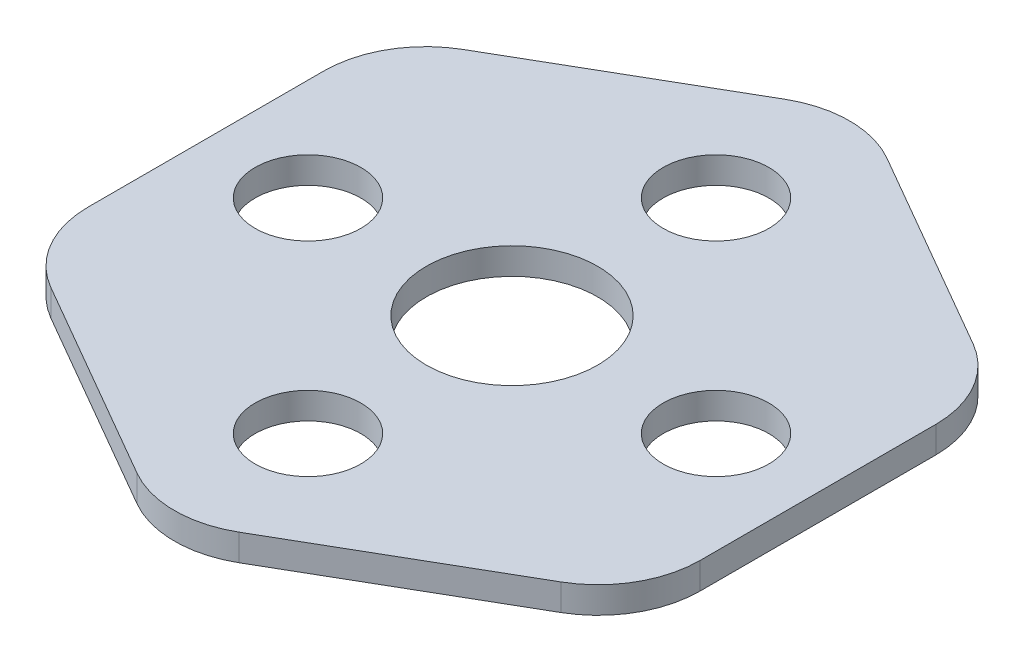
ISO-10303-21;
HEADER;
FILE_DESCRIPTION(('STEP AP214'),'2;1');
FILE_NAME('part.step','',(''),(''),'','','');
FILE_SCHEMA(('AUTOMOTIVE_DESIGN { 1 0 10303 214 1 1 1 1 }'));
ENDSEC;
DATA;
#1=APPLICATION_CONTEXT('core data for automotive mechanical design processes');
#2=APPLICATION_PROTOCOL_DEFINITION('international standard','automotive_design',2000,#1);
#3=PRODUCT_CONTEXT('',#1,'mechanical');
#4=PRODUCT('Part','Part','',(#3));
#5=PRODUCT_RELATED_PRODUCT_CATEGORY('part','',(#4));
#6=PRODUCT_DEFINITION_FORMATION('','',#4);
#7=PRODUCT_DEFINITION_CONTEXT('part definition',#1,'design');
#8=PRODUCT_DEFINITION('design','',#6,#7);
#9=PRODUCT_DEFINITION_SHAPE('','',#8);
#10=(LENGTH_UNIT() NAMED_UNIT(*) SI_UNIT(.MILLI.,.METRE.));
#11=(NAMED_UNIT(*) PLANE_ANGLE_UNIT() SI_UNIT($,.RADIAN.));
#12=(NAMED_UNIT(*) SI_UNIT($,.STERADIAN.) SOLID_ANGLE_UNIT());
#13=UNCERTAINTY_MEASURE_WITH_UNIT(LENGTH_MEASURE(1.E-05),#10,'distance_accuracy_value','');
#14=(GEOMETRIC_REPRESENTATION_CONTEXT(3) GLOBAL_UNCERTAINTY_ASSIGNED_CONTEXT((#13)) GLOBAL_UNIT_ASSIGNED_CONTEXT((#10,
#11,#12)) REPRESENTATION_CONTEXT('',''));
#15=CARTESIAN_POINT('',(0.,0.,0.));
#16=DIRECTION('',(0.,0.,1.));
#17=DIRECTION('',(1.,0.,0.));
#18=AXIS2_PLACEMENT_3D('',#15,#16,#17);
#19=CARTESIAN_POINT('',(15.,0.65,6.33974596215561));
#20=DIRECTION('',(-0.5,0.,0.866025403784439));
#21=DIRECTION('',(0.866025403784439,0.,0.5));
#22=AXIS2_PLACEMENT_3D('',#19,#20,#21);
#23=PLANE('',#22);
#24=DIRECTION('',(-0.866025403784439,0.,-0.5));
#25=VECTOR('',#24,1.);
#26=CARTESIAN_POINT('',(15.,-0.65,6.33974596215561));
#27=LINE('',#26,#25);
#28=CARTESIAN_POINT('',(12.5,-0.65,4.89637028918155));
#29=VERTEX_POINT('',#28);
#30=CARTESIAN_POINT('',(2.5,-0.65,-0.87713240271471));
#31=VERTEX_POINT('',#30);
#32=EDGE_CURVE('E161',#29,#31,#27,.T.);
#33=ORIENTED_EDGE('',*,*,#32,.T.);
#34=DIRECTION('',(0.,-1.,0.));
#35=VECTOR('',#34,1.);
#36=CARTESIAN_POINT('',(2.5,0.65,-0.877132402714711));
#37=LINE('',#36,#35);
#38=CARTESIAN_POINT('',(2.5,0.65,-0.87713240271471));
#39=VERTEX_POINT('',#38);
#40=EDGE_CURVE('E200',#31,#39,#37,.F.);
#41=ORIENTED_EDGE('',*,*,#40,.T.);
#42=DIRECTION('',(-0.866025403784439,0.,-0.5));
#43=VECTOR('',#42,1.);
#44=CARTESIAN_POINT('',(15.,0.65,6.33974596215561));
#45=LINE('',#44,#43);
#46=CARTESIAN_POINT('',(12.5,0.65,4.89637028918155));
#47=VERTEX_POINT('',#46);
#48=EDGE_CURVE('E171',#47,#39,#45,.T.);
#49=ORIENTED_EDGE('',*,*,#48,.F.);
#50=DIRECTION('',(0.,-1.,0.));
#51=VECTOR('',#50,1.);
#52=CARTESIAN_POINT('',(12.5,0.65,4.89637028918155));
#53=LINE('',#52,#51);
#54=EDGE_CURVE('E198',#47,#29,#53,.T.);
#55=ORIENTED_EDGE('',*,*,#54,.T.);
#56=EDGE_LOOP('',(#33,#41,#49,#55));
#57=FACE_BOUND('',#56,.T.);
#58=ADVANCED_FACE('F41',(#57),#23,.F.);
#59=CARTESIAN_POINT('',(0.,0.65,-2.32050807568877));
#60=DIRECTION('',(0.5,0.,0.866025403784439));
#61=DIRECTION('',(0.866025403784439,0.,-0.5));
#62=AXIS2_PLACEMENT_3D('',#59,#60,#61);
#63=PLANE('',#62);
#64=DIRECTION('',(-0.866025403784439,0.,0.5));
#65=VECTOR('',#64,1.);
#66=CARTESIAN_POINT('',(0.,-0.65,-2.32050807568877));
#67=LINE('',#66,#65);
#68=CARTESIAN_POINT('',(-2.5,-0.65,-0.877132402714709));
#69=VERTEX_POINT('',#68);
#70=CARTESIAN_POINT('',(-12.5,-0.65,4.89637028918155));
#71=VERTEX_POINT('',#70);
#72=EDGE_CURVE('E160',#69,#71,#67,.T.);
#73=ORIENTED_EDGE('',*,*,#72,.T.);
#74=DIRECTION('',(0.,-1.,0.));
#75=VECTOR('',#74,1.);
#76=CARTESIAN_POINT('',(-12.5,0.65,4.89637028918155));
#77=LINE('',#76,#75);
#78=CARTESIAN_POINT('',(-12.5,0.65,4.89637028918155));
#79=VERTEX_POINT('',#78);
#80=EDGE_CURVE('E139',#71,#79,#77,.F.);
#81=ORIENTED_EDGE('',*,*,#80,.T.);
#82=DIRECTION('',(-0.866025403784439,0.,0.5));
#83=VECTOR('',#82,1.);
#84=CARTESIAN_POINT('',(0.,0.65,-2.32050807568877));
#85=LINE('',#84,#83);
#86=CARTESIAN_POINT('',(-2.5,0.65,-0.877132402714709));
#87=VERTEX_POINT('',#86);
#88=EDGE_CURVE('E249',#87,#79,#85,.T.);
#89=ORIENTED_EDGE('',*,*,#88,.F.);
#90=DIRECTION('',(0.,-1.,0.));
#91=VECTOR('',#90,1.);
#92=CARTESIAN_POINT('',(-2.5,0.65,-0.877132402714709));
#93=LINE('',#92,#91);
#94=EDGE_CURVE('E142',#87,#69,#93,.T.);
#95=ORIENTED_EDGE('',*,*,#94,.T.);
#96=EDGE_LOOP('',(#73,#81,#89,#95));
#97=FACE_BOUND('',#96,.T.);
#98=ADVANCED_FACE('F256',(#97),#63,.F.);
#99=CARTESIAN_POINT('',(-15.,0.65,6.33974596215561));
#100=DIRECTION('',(1.,0.,0.));
#101=DIRECTION('',(0.,0.,-1.));
#102=AXIS2_PLACEMENT_3D('',#99,#100,#101);
#103=PLANE('',#102);
#104=DIRECTION('',(0.,0.,1.));
#105=VECTOR('',#104,1.);
#106=CARTESIAN_POINT('',(-15.,0.65,6.33974596215561));
#107=LINE('',#106,#105);
#108=CARTESIAN_POINT('',(-15.,0.65,9.22649730810374));
#109=VERTEX_POINT('',#108);
#110=CARTESIAN_POINT('',(-15.,0.65,20.7735026918963));
#111=VERTEX_POINT('',#110);
#112=EDGE_CURVE('E153',#109,#111,#107,.T.);
#113=ORIENTED_EDGE('',*,*,#112,.F.);
#114=DIRECTION('',(0.,-1.,0.));
#115=VECTOR('',#114,1.);
#116=CARTESIAN_POINT('',(-15.,0.65,9.22649730810374));
#117=LINE('',#116,#115);
#118=CARTESIAN_POINT('',(-15.,-0.65,9.22649730810374));
#119=VERTEX_POINT('',#118);
#120=EDGE_CURVE('E131',#109,#119,#117,.T.);
#121=ORIENTED_EDGE('',*,*,#120,.T.);
#122=DIRECTION('',(0.,0.,1.));
#123=VECTOR('',#122,1.);
#124=CARTESIAN_POINT('',(-15.,-0.65,6.33974596215561));
#125=LINE('',#124,#123);
#126=CARTESIAN_POINT('',(-15.,-0.65,20.7735026918963));
#127=VERTEX_POINT('',#126);
#128=EDGE_CURVE('E149',#119,#127,#125,.T.);
#129=ORIENTED_EDGE('',*,*,#128,.T.);
#130=DIRECTION('',(0.,-1.,0.));
#131=VECTOR('',#130,1.);
#132=CARTESIAN_POINT('',(-15.,0.65,20.7735026918963));
#133=LINE('',#132,#131);
#134=EDGE_CURVE('E152',#127,#111,#133,.F.);
#135=ORIENTED_EDGE('',*,*,#134,.T.);
#136=EDGE_LOOP('',(#113,#121,#129,#135));
#137=FACE_BOUND('',#136,.T.);
#138=ADVANCED_FACE('F150',(#137),#103,.F.);
#139=CARTESIAN_POINT('',(-15.,0.65,23.6602540378444));
#140=DIRECTION('',(0.5,0.,-0.866025403784439));
#141=DIRECTION('',(-0.866025403784439,0.,-0.5));
#142=AXIS2_PLACEMENT_3D('',#139,#140,#141);
#143=PLANE('',#142);
#144=DIRECTION('',(0.866025403784439,0.,0.5));
#145=VECTOR('',#144,1.);
#146=CARTESIAN_POINT('',(-15.,-0.65,23.6602540378444));
#147=LINE('',#146,#145);
#148=CARTESIAN_POINT('',(-12.5,-0.65,25.1036297108184));
#149=VERTEX_POINT('',#148);
#150=CARTESIAN_POINT('',(-2.49999999999999,-0.65,30.8771324027147));
#151=VERTEX_POINT('',#150);
#152=EDGE_CURVE('E156',#149,#151,#147,.T.);
#153=ORIENTED_EDGE('',*,*,#152,.T.);
#154=DIRECTION('',(0.,-1.,0.));
#155=VECTOR('',#154,1.);
#156=CARTESIAN_POINT('',(-2.49999999999999,0.65,30.8771324027147));
#157=LINE('',#156,#155);
#158=CARTESIAN_POINT('',(-2.49999999999999,0.65,30.8771324027147));
#159=VERTEX_POINT('',#158);
#160=EDGE_CURVE('E11',#151,#159,#157,.F.);
#161=ORIENTED_EDGE('',*,*,#160,.T.);
#162=DIRECTION('',(0.866025403784439,0.,0.5));
#163=VECTOR('',#162,1.);
#164=CARTESIAN_POINT('',(-15.,0.65,23.6602540378444));
#165=LINE('',#164,#163);
#166=CARTESIAN_POINT('',(-12.5,0.65,25.1036297108184));
#167=VERTEX_POINT('',#166);
#168=EDGE_CURVE('E218',#167,#159,#165,.T.);
#169=ORIENTED_EDGE('',*,*,#168,.F.);
#170=DIRECTION('',(0.,-1.,0.));
#171=VECTOR('',#170,1.);
#172=CARTESIAN_POINT('',(-12.5,0.65,25.1036297108184));
#173=LINE('',#172,#171);
#174=EDGE_CURVE('E47',#167,#149,#173,.T.);
#175=ORIENTED_EDGE('',*,*,#174,.T.);
#176=EDGE_LOOP('',(#153,#161,#169,#175));
#177=FACE_BOUND('',#176,.T.);
#178=ADVANCED_FACE('F214',(#177),#143,.F.);
#179=CARTESIAN_POINT('',(0.,0.65,32.3205080756888));
#180=DIRECTION('',(-0.5,0.,-0.866025403784438));
#181=DIRECTION('',(-0.866025403784439,0.,0.5));
#182=AXIS2_PLACEMENT_3D('',#179,#180,#181);
#183=PLANE('',#182);
#184=DIRECTION('',(0.866025403784438,0.,-0.5));
#185=VECTOR('',#184,1.);
#186=CARTESIAN_POINT('',(0.,-0.65,32.3205080756888));
#187=LINE('',#186,#185);
#188=CARTESIAN_POINT('',(2.50000000000001,-0.65,30.8771324027147));
#189=VERTEX_POINT('',#188);
#190=CARTESIAN_POINT('',(12.5,-0.65,25.1036297108184));
#191=VERTEX_POINT('',#190);
#192=EDGE_CURVE('E163',#189,#191,#187,.T.);
#193=ORIENTED_EDGE('',*,*,#192,.T.);
#194=DIRECTION('',(0.,-1.,0.));
#195=VECTOR('',#194,1.);
#196=CARTESIAN_POINT('',(12.5,0.65,25.1036297108184));
#197=LINE('',#196,#195);
#198=CARTESIAN_POINT('',(12.5,0.65,25.1036297108184));
#199=VERTEX_POINT('',#198);
#200=EDGE_CURVE('E206',#191,#199,#197,.F.);
#201=ORIENTED_EDGE('',*,*,#200,.T.);
#202=DIRECTION('',(0.866025403784438,0.,-0.5));
#203=VECTOR('',#202,1.);
#204=CARTESIAN_POINT('',(0.,0.65,32.3205080756888));
#205=LINE('',#204,#203);
#206=CARTESIAN_POINT('',(2.50000000000001,0.65,30.8771324027147));
#207=VERTEX_POINT('',#206);
#208=EDGE_CURVE('E226',#207,#199,#205,.T.);
#209=ORIENTED_EDGE('',*,*,#208,.F.);
#210=DIRECTION('',(0.,-1.,0.));
#211=VECTOR('',#210,1.);
#212=CARTESIAN_POINT('',(2.50000000000001,0.65,30.8771324027147));
#213=LINE('',#212,#211);
#214=EDGE_CURVE('E202',#207,#189,#213,.T.);
#215=ORIENTED_EDGE('',*,*,#214,.T.);
#216=EDGE_LOOP('',(#193,#201,#209,#215));
#217=FACE_BOUND('',#216,.T.);
#218=ADVANCED_FACE('F228',(#217),#183,.F.);
#219=CARTESIAN_POINT('',(15.,0.65,23.6602540378444));
#220=DIRECTION('',(-1.,0.,0.));
#221=DIRECTION('',(0.,0.,1.));
#222=AXIS2_PLACEMENT_3D('',#219,#220,#221);
#223=PLANE('',#222);
#224=DIRECTION('',(0.,0.,-1.));
#225=VECTOR('',#224,1.);
#226=CARTESIAN_POINT('',(15.,-0.65,23.6602540378444));
#227=LINE('',#226,#225);
#228=CARTESIAN_POINT('',(15.,-0.65,20.7735026918963));
#229=VERTEX_POINT('',#228);
#230=CARTESIAN_POINT('',(15.,-0.65,9.22649730810374));
#231=VERTEX_POINT('',#230);
#232=EDGE_CURVE('E169',#229,#231,#227,.T.);
#233=ORIENTED_EDGE('',*,*,#232,.T.);
#234=DIRECTION('',(0.,-1.,0.));
#235=VECTOR('',#234,1.);
#236=CARTESIAN_POINT('',(15.,0.65,9.22649730810374));
#237=LINE('',#236,#235);
#238=CARTESIAN_POINT('',(15.,0.65,9.22649730810374));
#239=VERTEX_POINT('',#238);
#240=EDGE_CURVE('E57',#231,#239,#237,.F.);
#241=ORIENTED_EDGE('',*,*,#240,.T.);
#242=DIRECTION('',(0.,0.,-1.));
#243=VECTOR('',#242,1.);
#244=CARTESIAN_POINT('',(15.,0.65,23.6602540378444));
#245=LINE('',#244,#243);
#246=CARTESIAN_POINT('',(15.,0.65,20.7735026918963));
#247=VERTEX_POINT('',#246);
#248=EDGE_CURVE('E175',#247,#239,#245,.T.);
#249=ORIENTED_EDGE('',*,*,#248,.F.);
#250=DIRECTION('',(0.,-1.,0.));
#251=VECTOR('',#250,1.);
#252=CARTESIAN_POINT('',(15.,0.65,20.7735026918963));
#253=LINE('',#252,#251);
#254=EDGE_CURVE('E204',#247,#229,#253,.T.);
#255=ORIENTED_EDGE('',*,*,#254,.T.);
#256=EDGE_LOOP('',(#233,#241,#249,#255));
#257=FACE_BOUND('',#256,.T.);
#258=ADVANCED_FACE('F289',(#257),#223,.F.);
#259=CARTESIAN_POINT('',(0.,0.65,0.));
#260=DIRECTION('',(0.,1.,0.));
#261=DIRECTION('',(0.,0.,1.));
#262=AXIS2_PLACEMENT_3D('',#259,#260,#261);
#263=PLANE('',#262);
#264=CARTESIAN_POINT('',(0.,0.65,15.));
#265=DIRECTION('',(0.,1.,0.));
#266=DIRECTION('',(0.,0.,1.));
#267=AXIS2_PLACEMENT_3D('',#264,#265,#266);
#268=CIRCLE('',#267,4.2);
#269=CARTESIAN_POINT('',(0.,0.65,19.2));
#270=VERTEX_POINT('',#269);
#271=EDGE_CURVE('E435',#270,#270,#268,.T.);
#272=ORIENTED_EDGE('',*,*,#271,.F.);
#273=EDGE_LOOP('',(#272));
#274=FACE_BOUND('',#273,.T.);
#275=CARTESIAN_POINT('',(0.,0.65,5.));
#276=DIRECTION('',(0.,1.,0.));
#277=DIRECTION('',(0.,0.,1.));
#278=AXIS2_PLACEMENT_3D('',#275,#276,#277);
#279=CIRCLE('',#278,2.5908);
#280=CARTESIAN_POINT('',(0.,0.65,7.5908));
#281=VERTEX_POINT('',#280);
#282=EDGE_CURVE('E432',#281,#281,#279,.T.);
#283=ORIENTED_EDGE('',*,*,#282,.F.);
#284=EDGE_LOOP('',(#283));
#285=FACE_BOUND('',#284,.T.);
#286=CARTESIAN_POINT('',(-10.,0.65,15.));
#287=DIRECTION('',(0.,1.,0.));
#288=DIRECTION('',(0.,0.,1.));
#289=AXIS2_PLACEMENT_3D('',#286,#287,#288);
#290=CIRCLE('',#289,2.5908);
#291=CARTESIAN_POINT('',(-10.,0.65,17.5908));
#292=VERTEX_POINT('',#291);
#293=EDGE_CURVE('E445',#292,#292,#290,.T.);
#294=ORIENTED_EDGE('',*,*,#293,.F.);
#295=EDGE_LOOP('',(#294));
#296=FACE_BOUND('',#295,.T.);
#297=CARTESIAN_POINT('',(0.,0.65,25.));
#298=DIRECTION('',(0.,1.,0.));
#299=DIRECTION('',(0.,0.,1.));
#300=AXIS2_PLACEMENT_3D('',#297,#298,#299);
#301=CIRCLE('',#300,2.5908);
#302=CARTESIAN_POINT('',(0.,0.65,27.5908));
#303=VERTEX_POINT('',#302);
#304=EDGE_CURVE('E449',#303,#303,#301,.T.);
#305=ORIENTED_EDGE('',*,*,#304,.F.);
#306=EDGE_LOOP('',(#305));
#307=FACE_BOUND('',#306,.T.);
#308=CARTESIAN_POINT('',(10.,0.65,15.));
#309=DIRECTION('',(0.,1.,0.));
#310=DIRECTION('',(0.,0.,1.));
#311=AXIS2_PLACEMENT_3D('',#308,#309,#310);
#312=CIRCLE('',#311,2.5908);
#313=CARTESIAN_POINT('',(10.,0.65,17.5908));
#314=VERTEX_POINT('',#313);
#315=EDGE_CURVE('E237',#314,#314,#312,.T.);
#316=ORIENTED_EDGE('',*,*,#315,.F.);
#317=EDGE_LOOP('',(#316));
#318=FACE_BOUND('',#317,.T.);
#319=ORIENTED_EDGE('',*,*,#88,.T.);
#320=CARTESIAN_POINT('',(-10.,0.65,9.22649730810374));
#321=DIRECTION('',(0.,1.,0.));
#322=DIRECTION('',(0.,0.,1.));
#323=AXIS2_PLACEMENT_3D('',#320,#321,#322);
#324=CIRCLE('',#323,5.);
#325=EDGE_CURVE('E191',#79,#109,#324,.T.);
#326=ORIENTED_EDGE('',*,*,#325,.T.);
#327=ORIENTED_EDGE('',*,*,#112,.T.);
#328=CARTESIAN_POINT('',(-10.,0.65,20.7735026918963));
#329=DIRECTION('',(0.,1.,0.));
#330=DIRECTION('',(0.,0.,1.));
#331=AXIS2_PLACEMENT_3D('',#328,#329,#330);
#332=CIRCLE('',#331,5.);
#333=EDGE_CURVE('E184',#111,#167,#332,.T.);
#334=ORIENTED_EDGE('',*,*,#333,.T.);
#335=ORIENTED_EDGE('',*,*,#168,.T.);
#336=CARTESIAN_POINT('',(0.,0.65,26.5470053837925));
#337=DIRECTION('',(0.,1.,0.));
#338=DIRECTION('',(0.,0.,1.));
#339=AXIS2_PLACEMENT_3D('',#336,#337,#338);
#340=CIRCLE('',#339,5.);
#341=EDGE_CURVE('E190',#159,#207,#340,.T.);
#342=ORIENTED_EDGE('',*,*,#341,.T.);
#343=ORIENTED_EDGE('',*,*,#208,.T.);
#344=CARTESIAN_POINT('',(10.,0.65,20.7735026918963));
#345=DIRECTION('',(0.,1.,0.));
#346=DIRECTION('',(0.,0.,1.));
#347=AXIS2_PLACEMENT_3D('',#344,#345,#346);
#348=CIRCLE('',#347,5.);
#349=EDGE_CURVE('E64',#199,#247,#348,.T.);
#350=ORIENTED_EDGE('',*,*,#349,.T.);
#351=ORIENTED_EDGE('',*,*,#248,.T.);
#352=CARTESIAN_POINT('',(10.,0.65,9.22649730810374));
#353=DIRECTION('',(0.,1.,0.));
#354=DIRECTION('',(0.,0.,1.));
#355=AXIS2_PLACEMENT_3D('',#352,#353,#354);
#356=CIRCLE('',#355,5.);
#357=EDGE_CURVE('E188',#239,#47,#356,.T.);
#358=ORIENTED_EDGE('',*,*,#357,.T.);
#359=ORIENTED_EDGE('',*,*,#48,.T.);
#360=CARTESIAN_POINT('',(0.,0.65,3.45299461620749));
#361=DIRECTION('',(0.,1.,0.));
#362=DIRECTION('',(0.,0.,1.));
#363=AXIS2_PLACEMENT_3D('',#360,#361,#362);
#364=CIRCLE('',#363,5.);
#365=EDGE_CURVE('E195',#39,#87,#364,.T.);
#366=ORIENTED_EDGE('',*,*,#365,.T.);
#367=EDGE_LOOP('',(#319,#326,#327,#334,#335,#342,#343,#350,#351,#358,#359,#366));
#368=FACE_BOUND('',#367,.T.);
#369=ADVANCED_FACE('F255',(#274,#285,#296,#307,#318,#368),#263,.T.);
#370=CARTESIAN_POINT('',(0.,-0.65,0.));
#371=DIRECTION('',(0.,1.,0.));
#372=DIRECTION('',(0.,0.,1.));
#373=AXIS2_PLACEMENT_3D('',#370,#371,#372);
#374=PLANE('',#373);
#375=CARTESIAN_POINT('',(0.,-0.65,15.));
#376=DIRECTION('',(0.,1.,0.));
#377=DIRECTION('',(0.,0.,1.));
#378=AXIS2_PLACEMENT_3D('',#375,#376,#377);
#379=CIRCLE('',#378,4.2);
#380=CARTESIAN_POINT('',(0.,-0.65,19.2));
#381=VERTEX_POINT('',#380);
#382=EDGE_CURVE('E429',#381,#381,#379,.T.);
#383=ORIENTED_EDGE('',*,*,#382,.T.);
#384=EDGE_LOOP('',(#383));
#385=FACE_BOUND('',#384,.T.);
#386=CARTESIAN_POINT('',(0.,-0.65,5.));
#387=DIRECTION('',(0.,1.,0.));
#388=DIRECTION('',(0.,0.,1.));
#389=AXIS2_PLACEMENT_3D('',#386,#387,#388);
#390=CIRCLE('',#389,2.5908);
#391=CARTESIAN_POINT('',(0.,-0.65,7.5908));
#392=VERTEX_POINT('',#391);
#393=EDGE_CURVE('E437',#392,#392,#390,.T.);
#394=ORIENTED_EDGE('',*,*,#393,.T.);
#395=EDGE_LOOP('',(#394));
#396=FACE_BOUND('',#395,.T.);
#397=CARTESIAN_POINT('',(-10.,-0.65,15.));
#398=DIRECTION('',(0.,1.,0.));
#399=DIRECTION('',(0.,0.,1.));
#400=AXIS2_PLACEMENT_3D('',#397,#398,#399);
#401=CIRCLE('',#400,2.5908);
#402=CARTESIAN_POINT('',(-10.,-0.65,17.5908));
#403=VERTEX_POINT('',#402);
#404=EDGE_CURVE('E444',#403,#403,#401,.T.);
#405=ORIENTED_EDGE('',*,*,#404,.T.);
#406=EDGE_LOOP('',(#405));
#407=FACE_BOUND('',#406,.T.);
#408=CARTESIAN_POINT('',(0.,-0.65,25.));
#409=DIRECTION('',(0.,1.,0.));
#410=DIRECTION('',(0.,0.,1.));
#411=AXIS2_PLACEMENT_3D('',#408,#409,#410);
#412=CIRCLE('',#411,2.5908);
#413=CARTESIAN_POINT('',(0.,-0.65,27.5908));
#414=VERTEX_POINT('',#413);
#415=EDGE_CURVE('E242',#414,#414,#412,.T.);
#416=ORIENTED_EDGE('',*,*,#415,.T.);
#417=EDGE_LOOP('',(#416));
#418=FACE_BOUND('',#417,.T.);
#419=CARTESIAN_POINT('',(10.,-0.65,15.));
#420=DIRECTION('',(0.,1.,0.));
#421=DIRECTION('',(0.,0.,1.));
#422=AXIS2_PLACEMENT_3D('',#419,#420,#421);
#423=CIRCLE('',#422,2.5908);
#424=CARTESIAN_POINT('',(10.,-0.65,17.5908));
#425=VERTEX_POINT('',#424);
#426=EDGE_CURVE('E234',#425,#425,#423,.T.);
#427=ORIENTED_EDGE('',*,*,#426,.T.);
#428=EDGE_LOOP('',(#427));
#429=FACE_BOUND('',#428,.T.);
#430=ORIENTED_EDGE('',*,*,#128,.F.);
#431=CARTESIAN_POINT('',(-10.,-0.65,9.22649730810374));
#432=DIRECTION('',(0.,1.,0.));
#433=DIRECTION('',(0.,0.,1.));
#434=AXIS2_PLACEMENT_3D('',#431,#432,#433);
#435=CIRCLE('',#434,5.);
#436=EDGE_CURVE('E133',#119,#71,#435,.F.);
#437=ORIENTED_EDGE('',*,*,#436,.T.);
#438=ORIENTED_EDGE('',*,*,#72,.F.);
#439=CARTESIAN_POINT('',(0.,-0.65,3.45299461620749));
#440=DIRECTION('',(0.,1.,0.));
#441=DIRECTION('',(0.,0.,1.));
#442=AXIS2_PLACEMENT_3D('',#439,#440,#441);
#443=CIRCLE('',#442,5.);
#444=EDGE_CURVE('E145',#69,#31,#443,.F.);
#445=ORIENTED_EDGE('',*,*,#444,.T.);
#446=ORIENTED_EDGE('',*,*,#32,.F.);
#447=CARTESIAN_POINT('',(10.,-0.65,9.22649730810374));
#448=DIRECTION('',(0.,1.,0.));
#449=DIRECTION('',(0.,0.,1.));
#450=AXIS2_PLACEMENT_3D('',#447,#448,#449);
#451=CIRCLE('',#450,5.);
#452=EDGE_CURVE('E177',#29,#231,#451,.F.);
#453=ORIENTED_EDGE('',*,*,#452,.T.);
#454=ORIENTED_EDGE('',*,*,#232,.F.);
#455=CARTESIAN_POINT('',(10.,-0.65,20.7735026918963));
#456=DIRECTION('',(0.,1.,0.));
#457=DIRECTION('',(0.,0.,1.));
#458=AXIS2_PLACEMENT_3D('',#455,#456,#457);
#459=CIRCLE('',#458,5.);
#460=EDGE_CURVE('E180',#229,#191,#459,.F.);
#461=ORIENTED_EDGE('',*,*,#460,.T.);
#462=ORIENTED_EDGE('',*,*,#192,.F.);
#463=CARTESIAN_POINT('',(0.,-0.65,26.5470053837925));
#464=DIRECTION('',(0.,1.,0.));
#465=DIRECTION('',(0.,0.,1.));
#466=AXIS2_PLACEMENT_3D('',#463,#464,#465);
#467=CIRCLE('',#466,5.);
#468=EDGE_CURVE('E174',#189,#151,#467,.F.);
#469=ORIENTED_EDGE('',*,*,#468,.T.);
#470=ORIENTED_EDGE('',*,*,#152,.F.);
#471=CARTESIAN_POINT('',(-10.,-0.65,20.7735026918963));
#472=DIRECTION('',(0.,1.,0.));
#473=DIRECTION('',(0.,0.,1.));
#474=AXIS2_PLACEMENT_3D('',#471,#472,#473);
#475=CIRCLE('',#474,5.);
#476=EDGE_CURVE('E154',#149,#127,#475,.F.);
#477=ORIENTED_EDGE('',*,*,#476,.T.);
#478=EDGE_LOOP('',(#430,#437,#438,#445,#446,#453,#454,#461,#462,#469,#470,#477));
#479=FACE_BOUND('',#478,.T.);
#480=ADVANCED_FACE('F151',(#385,#396,#407,#418,#429,#479),#374,.F.);
#481=CARTESIAN_POINT('',(10.,0.65,15.));
#482=DIRECTION('',(0.,1.,0.));
#483=DIRECTION('',(0.,0.,1.));
#484=AXIS2_PLACEMENT_3D('',#481,#482,#483);
#485=CYLINDRICAL_SURFACE('',#484,2.5908);
#486=ORIENTED_EDGE('',*,*,#426,.F.);
#487=EDGE_LOOP('',(#486));
#488=FACE_BOUND('',#487,.T.);
#489=ORIENTED_EDGE('',*,*,#315,.T.);
#490=EDGE_LOOP('',(#489));
#491=FACE_BOUND('',#490,.T.);
#492=ADVANCED_FACE('F338',(#488,#491),#485,.F.);
#493=CARTESIAN_POINT('',(0.,0.65,25.));
#494=DIRECTION('',(0.,1.,0.));
#495=DIRECTION('',(0.,0.,1.));
#496=AXIS2_PLACEMENT_3D('',#493,#494,#495);
#497=CYLINDRICAL_SURFACE('',#496,2.5908);
#498=ORIENTED_EDGE('',*,*,#415,.F.);
#499=EDGE_LOOP('',(#498));
#500=FACE_BOUND('',#499,.T.);
#501=ORIENTED_EDGE('',*,*,#304,.T.);
#502=EDGE_LOOP('',(#501));
#503=FACE_BOUND('',#502,.T.);
#504=ADVANCED_FACE('F346',(#500,#503),#497,.F.);
#505=CARTESIAN_POINT('',(-10.,0.65,15.));
#506=DIRECTION('',(0.,1.,0.));
#507=DIRECTION('',(0.,0.,1.));
#508=AXIS2_PLACEMENT_3D('',#505,#506,#507);
#509=CYLINDRICAL_SURFACE('',#508,2.5908);
#510=ORIENTED_EDGE('',*,*,#404,.F.);
#511=EDGE_LOOP('',(#510));
#512=FACE_BOUND('',#511,.T.);
#513=ORIENTED_EDGE('',*,*,#293,.T.);
#514=EDGE_LOOP('',(#513));
#515=FACE_BOUND('',#514,.T.);
#516=ADVANCED_FACE('F363',(#512,#515),#509,.F.);
#517=CARTESIAN_POINT('',(0.,0.65,5.));
#518=DIRECTION('',(0.,1.,0.));
#519=DIRECTION('',(0.,0.,1.));
#520=AXIS2_PLACEMENT_3D('',#517,#518,#519);
#521=CYLINDRICAL_SURFACE('',#520,2.5908);
#522=ORIENTED_EDGE('',*,*,#393,.F.);
#523=EDGE_LOOP('',(#522));
#524=FACE_BOUND('',#523,.T.);
#525=ORIENTED_EDGE('',*,*,#282,.T.);
#526=EDGE_LOOP('',(#525));
#527=FACE_BOUND('',#526,.T.);
#528=ADVANCED_FACE('F375',(#524,#527),#521,.F.);
#529=CARTESIAN_POINT('',(0.,0.65,15.));
#530=DIRECTION('',(0.,1.,0.));
#531=DIRECTION('',(0.,0.,1.));
#532=AXIS2_PLACEMENT_3D('',#529,#530,#531);
#533=CYLINDRICAL_SURFACE('',#532,4.2);
#534=ORIENTED_EDGE('',*,*,#382,.F.);
#535=EDGE_LOOP('',(#534));
#536=FACE_BOUND('',#535,.T.);
#537=ORIENTED_EDGE('',*,*,#271,.T.);
#538=EDGE_LOOP('',(#537));
#539=FACE_BOUND('',#538,.T.);
#540=ADVANCED_FACE('F275',(#536,#539),#533,.F.);
#541=CARTESIAN_POINT('',(-10.,0.65,9.22649730810374));
#542=DIRECTION('',(0.,-1.,0.));
#543=DIRECTION('',(0.,0.,-1.));
#544=AXIS2_PLACEMENT_3D('',#541,#542,#543);
#545=CYLINDRICAL_SURFACE('',#544,5.);
#546=ORIENTED_EDGE('',*,*,#325,.F.);
#547=ORIENTED_EDGE('',*,*,#80,.F.);
#548=ORIENTED_EDGE('',*,*,#436,.F.);
#549=ORIENTED_EDGE('',*,*,#120,.F.);
#550=EDGE_LOOP('',(#546,#547,#548,#549));
#551=FACE_BOUND('',#550,.T.);
#552=ADVANCED_FACE('F135',(#551),#545,.T.);
#553=CARTESIAN_POINT('',(0.,0.65,3.45299461620749));
#554=DIRECTION('',(0.,-1.,0.));
#555=DIRECTION('',(0.,0.,-1.));
#556=AXIS2_PLACEMENT_3D('',#553,#554,#555);
#557=CYLINDRICAL_SURFACE('',#556,5.);
#558=ORIENTED_EDGE('',*,*,#365,.F.);
#559=ORIENTED_EDGE('',*,*,#40,.F.);
#560=ORIENTED_EDGE('',*,*,#444,.F.);
#561=ORIENTED_EDGE('',*,*,#94,.F.);
#562=EDGE_LOOP('',(#558,#559,#560,#561));
#563=FACE_BOUND('',#562,.T.);
#564=ADVANCED_FACE('F272',(#563),#557,.T.);
#565=CARTESIAN_POINT('',(10.,0.65,9.22649730810374));
#566=DIRECTION('',(0.,-1.,0.));
#567=DIRECTION('',(0.,0.,-1.));
#568=AXIS2_PLACEMENT_3D('',#565,#566,#567);
#569=CYLINDRICAL_SURFACE('',#568,5.);
#570=ORIENTED_EDGE('',*,*,#357,.F.);
#571=ORIENTED_EDGE('',*,*,#240,.F.);
#572=ORIENTED_EDGE('',*,*,#452,.F.);
#573=ORIENTED_EDGE('',*,*,#54,.F.);
#574=EDGE_LOOP('',(#570,#571,#572,#573));
#575=FACE_BOUND('',#574,.T.);
#576=ADVANCED_FACE('F273',(#575),#569,.T.);
#577=CARTESIAN_POINT('',(10.,0.65,20.7735026918963));
#578=DIRECTION('',(0.,-1.,0.));
#579=DIRECTION('',(0.,0.,-1.));
#580=AXIS2_PLACEMENT_3D('',#577,#578,#579);
#581=CYLINDRICAL_SURFACE('',#580,5.);
#582=ORIENTED_EDGE('',*,*,#349,.F.);
#583=ORIENTED_EDGE('',*,*,#200,.F.);
#584=ORIENTED_EDGE('',*,*,#460,.F.);
#585=ORIENTED_EDGE('',*,*,#254,.F.);
#586=EDGE_LOOP('',(#582,#583,#584,#585));
#587=FACE_BOUND('',#586,.T.);
#588=ADVANCED_FACE('F260',(#587),#581,.T.);
#589=CARTESIAN_POINT('',(0.,0.65,26.5470053837925));
#590=DIRECTION('',(0.,-1.,0.));
#591=DIRECTION('',(0.,0.,-1.));
#592=AXIS2_PLACEMENT_3D('',#589,#590,#591);
#593=CYLINDRICAL_SURFACE('',#592,5.);
#594=ORIENTED_EDGE('',*,*,#341,.F.);
#595=ORIENTED_EDGE('',*,*,#160,.F.);
#596=ORIENTED_EDGE('',*,*,#468,.F.);
#597=ORIENTED_EDGE('',*,*,#214,.F.);
#598=EDGE_LOOP('',(#594,#595,#596,#597));
#599=FACE_BOUND('',#598,.T.);
#600=ADVANCED_FACE('F225',(#599),#593,.T.);
#601=CARTESIAN_POINT('',(-10.,0.65,20.7735026918963));
#602=DIRECTION('',(0.,-1.,0.));
#603=DIRECTION('',(0.,0.,-1.));
#604=AXIS2_PLACEMENT_3D('',#601,#602,#603);
#605=CYLINDRICAL_SURFACE('',#604,5.);
#606=ORIENTED_EDGE('',*,*,#333,.F.);
#607=ORIENTED_EDGE('',*,*,#134,.F.);
#608=ORIENTED_EDGE('',*,*,#476,.F.);
#609=ORIENTED_EDGE('',*,*,#174,.F.);
#610=EDGE_LOOP('',(#606,#607,#608,#609));
#611=FACE_BOUND('',#610,.T.);
#612=ADVANCED_FACE('F43',(#611),#605,.T.);
#613=CLOSED_SHELL('',(#58,#98,#138,#178,#218,#258,#369,#480,#492,#504,#516,#528,#540,#552,#564,
#576,#588,#600,#612));
#614=MANIFOLD_SOLID_BREP('B2',#613);
#615=ADVANCED_BREP_SHAPE_REPRESENTATION('',(#18,#614),#14);
#616=SHAPE_DEFINITION_REPRESENTATION(#9,#615);
ENDSEC;
END-ISO-10303-21;
